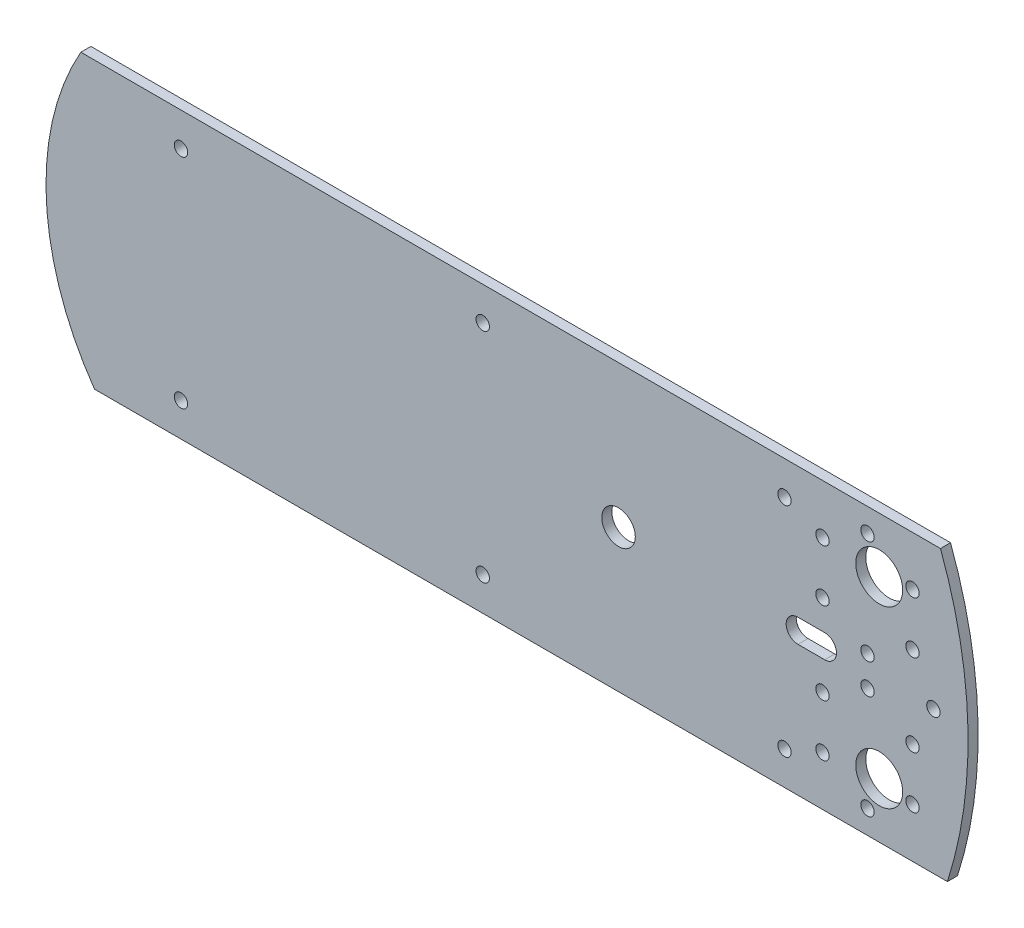
ISO-10303-21;
HEADER;
FILE_DESCRIPTION(('STEP AP214'),'2;1');
FILE_NAME('part.step','',(''),(''),'','','');
FILE_SCHEMA(('AUTOMOTIVE_DESIGN { 1 0 10303 214 1 1 1 1 }'));
ENDSEC;
DATA;
#1=APPLICATION_CONTEXT('core data for automotive mechanical design processes');
#2=APPLICATION_PROTOCOL_DEFINITION('international standard','automotive_design',2000,#1);
#3=PRODUCT_CONTEXT('',#1,'mechanical');
#4=PRODUCT('Part','Part','',(#3));
#5=PRODUCT_RELATED_PRODUCT_CATEGORY('part','',(#4));
#6=PRODUCT_DEFINITION_FORMATION('','',#4);
#7=PRODUCT_DEFINITION_CONTEXT('part definition',#1,'design');
#8=PRODUCT_DEFINITION('design','',#6,#7);
#9=PRODUCT_DEFINITION_SHAPE('','',#8);
#10=(LENGTH_UNIT() NAMED_UNIT(*) SI_UNIT(.MILLI.,.METRE.));
#11=(NAMED_UNIT(*) PLANE_ANGLE_UNIT() SI_UNIT($,.RADIAN.));
#12=(NAMED_UNIT(*) SI_UNIT($,.STERADIAN.) SOLID_ANGLE_UNIT());
#13=UNCERTAINTY_MEASURE_WITH_UNIT(LENGTH_MEASURE(1.E-05),#10,'distance_accuracy_value','');
#14=(GEOMETRIC_REPRESENTATION_CONTEXT(3) GLOBAL_UNCERTAINTY_ASSIGNED_CONTEXT((#13)) GLOBAL_UNIT_ASSIGNED_CONTEXT((#10,
#11,#12)) REPRESENTATION_CONTEXT('',''));
#15=CARTESIAN_POINT('',(0.,0.,0.));
#16=DIRECTION('',(0.,0.,1.));
#17=DIRECTION('',(1.,0.,0.));
#18=AXIS2_PLACEMENT_3D('',#15,#16,#17);
#19=CARTESIAN_POINT('',(122.251926795963,0.,33.));
#20=DIRECTION('',(0.,0.,-1.));
#21=DIRECTION('',(-1.,0.,0.));
#22=AXIS2_PLACEMENT_3D('',#19,#20,#21);
#23=CYLINDRICAL_SURFACE('',#22,3.5);
#24=CARTESIAN_POINT('',(122.251926795963,0.,30.));
#25=DIRECTION('',(0.,0.,1.));
#26=DIRECTION('',(1.,0.,0.));
#27=AXIS2_PLACEMENT_3D('',#24,#25,#26);
#28=CIRCLE('',#27,3.5);
#29=CARTESIAN_POINT('',(122.251926795963,-3.5,30.));
#30=VERTEX_POINT('',#29);
#31=CARTESIAN_POINT('',(122.251926795963,3.5,30.));
#32=VERTEX_POINT('',#31);
#33=EDGE_CURVE('E208',#30,#32,#28,.T.);
#34=ORIENTED_EDGE('',*,*,#33,.F.);
#35=DIRECTION('',(0.,0.,-1.));
#36=VECTOR('',#35,1.);
#37=CARTESIAN_POINT('',(122.251926795963,-3.5,33.));
#38=LINE('',#37,#36);
#39=CARTESIAN_POINT('',(122.251926795963,-3.5,33.));
#40=VERTEX_POINT('',#39);
#41=EDGE_CURVE('E11',#40,#30,#38,.T.);
#42=ORIENTED_EDGE('',*,*,#41,.F.);
#43=CARTESIAN_POINT('',(122.251926795963,0.,33.));
#44=DIRECTION('',(0.,0.,1.));
#45=DIRECTION('',(1.,0.,0.));
#46=AXIS2_PLACEMENT_3D('',#43,#44,#45);
#47=CIRCLE('',#46,3.5);
#48=CARTESIAN_POINT('',(122.251926795963,3.5,33.));
#49=VERTEX_POINT('',#48);
#50=EDGE_CURVE('E125',#40,#49,#47,.T.);
#51=ORIENTED_EDGE('',*,*,#50,.T.);
#52=DIRECTION('',(0.,0.,-1.));
#53=VECTOR('',#52,1.);
#54=CARTESIAN_POINT('',(122.251926795963,3.5,33.));
#55=LINE('',#54,#53);
#56=EDGE_CURVE('E88',#49,#32,#55,.T.);
#57=ORIENTED_EDGE('',*,*,#56,.T.);
#58=EDGE_LOOP('',(#34,#42,#51,#57));
#59=FACE_BOUND('',#58,.T.);
#60=ADVANCED_FACE('F35',(#59),#23,.F.);
#61=CARTESIAN_POINT('',(0.,-3.5,33.));
#62=DIRECTION('',(0.,1.,0.));
#63=DIRECTION('',(0.,0.,1.));
#64=AXIS2_PLACEMENT_3D('',#61,#62,#63);
#65=PLANE('',#64);
#66=DIRECTION('',(1.,0.,0.));
#67=VECTOR('',#66,1.);
#68=CARTESIAN_POINT('',(0.,-3.5,30.));
#69=LINE('',#68,#67);
#70=CARTESIAN_POINT('',(114.251926795963,-3.5,30.));
#71=VERTEX_POINT('',#70);
#72=EDGE_CURVE('E116',#71,#30,#69,.T.);
#73=ORIENTED_EDGE('',*,*,#72,.F.);
#74=DIRECTION('',(0.,0.,-1.));
#75=VECTOR('',#74,1.);
#76=CARTESIAN_POINT('',(114.251926795963,-3.5,33.));
#77=LINE('',#76,#75);
#78=CARTESIAN_POINT('',(114.251926795963,-3.5,33.));
#79=VERTEX_POINT('',#78);
#80=EDGE_CURVE('E45',#79,#71,#77,.T.);
#81=ORIENTED_EDGE('',*,*,#80,.F.);
#82=DIRECTION('',(1.,0.,0.));
#83=VECTOR('',#82,1.);
#84=CARTESIAN_POINT('',(0.,-3.5,33.));
#85=LINE('',#84,#83);
#86=EDGE_CURVE('E114',#79,#40,#85,.T.);
#87=ORIENTED_EDGE('',*,*,#86,.T.);
#88=ORIENTED_EDGE('',*,*,#41,.T.);
#89=EDGE_LOOP('',(#73,#81,#87,#88));
#90=FACE_BOUND('',#89,.T.);
#91=ADVANCED_FACE('F113',(#90),#65,.T.);
#92=CARTESIAN_POINT('',(114.251926795963,0.,33.));
#93=DIRECTION('',(0.,0.,-1.));
#94=DIRECTION('',(-1.,0.,0.));
#95=AXIS2_PLACEMENT_3D('',#92,#93,#94);
#96=CYLINDRICAL_SURFACE('',#95,3.5);
#97=CARTESIAN_POINT('',(114.251926795963,0.,30.));
#98=DIRECTION('',(0.,0.,1.));
#99=DIRECTION('',(1.,0.,0.));
#100=AXIS2_PLACEMENT_3D('',#97,#98,#99);
#101=CIRCLE('',#100,3.5);
#102=CARTESIAN_POINT('',(114.251926795963,3.5,30.));
#103=VERTEX_POINT('',#102);
#104=EDGE_CURVE('E212',#103,#71,#101,.T.);
#105=ORIENTED_EDGE('',*,*,#104,.F.);
#106=DIRECTION('',(0.,0.,-1.));
#107=VECTOR('',#106,1.);
#108=CARTESIAN_POINT('',(114.251926795963,3.5,33.));
#109=LINE('',#108,#107);
#110=CARTESIAN_POINT('',(114.251926795963,3.5,33.));
#111=VERTEX_POINT('',#110);
#112=EDGE_CURVE('E81',#111,#103,#109,.T.);
#113=ORIENTED_EDGE('',*,*,#112,.F.);
#114=CARTESIAN_POINT('',(114.251926795963,0.,33.));
#115=DIRECTION('',(0.,0.,1.));
#116=DIRECTION('',(1.,0.,0.));
#117=AXIS2_PLACEMENT_3D('',#114,#115,#116);
#118=CIRCLE('',#117,3.5);
#119=EDGE_CURVE('E124',#111,#79,#118,.T.);
#120=ORIENTED_EDGE('',*,*,#119,.T.);
#121=ORIENTED_EDGE('',*,*,#80,.T.);
#122=EDGE_LOOP('',(#105,#113,#120,#121));
#123=FACE_BOUND('',#122,.T.);
#124=ADVANCED_FACE('F127',(#123),#96,.F.);
#125=CARTESIAN_POINT('',(0.,-42.5,33.));
#126=DIRECTION('',(0.,1.,0.));
#127=DIRECTION('',(-1.,0.,0.));
#128=AXIS2_PLACEMENT_3D('',#125,#126,#127);
#129=PLANE('',#128);
#130=DIRECTION('',(1.,0.,0.));
#131=VECTOR('',#130,1.);
#132=CARTESIAN_POINT('',(0.,-42.5,30.));
#133=LINE('',#132,#131);
#134=CARTESIAN_POINT('',(-95.5175619591588,-42.5,30.));
#135=VERTEX_POINT('',#134);
#136=CARTESIAN_POINT('',(158.843575197652,-42.5000000000001,30.));
#137=VERTEX_POINT('',#136);
#138=EDGE_CURVE('E187',#135,#137,#133,.T.);
#139=ORIENTED_EDGE('',*,*,#138,.T.);
#140=DIRECTION('',(0.,0.,-1.));
#141=VECTOR('',#140,1.);
#142=CARTESIAN_POINT('',(158.843575197652,-42.5000000000001,33.));
#143=LINE('',#142,#141);
#144=CARTESIAN_POINT('',(158.843575197652,-42.5000000000001,33.));
#145=VERTEX_POINT('',#144);
#146=EDGE_CURVE('E39',#145,#137,#143,.T.);
#147=ORIENTED_EDGE('',*,*,#146,.F.);
#148=DIRECTION('',(1.,0.,0.));
#149=VECTOR('',#148,1.);
#150=CARTESIAN_POINT('',(0.,-42.5,33.));
#151=LINE('',#150,#149);
#152=CARTESIAN_POINT('',(-95.5175619591588,-42.5,33.));
#153=VERTEX_POINT('',#152);
#154=EDGE_CURVE('E270',#153,#145,#151,.T.);
#155=ORIENTED_EDGE('',*,*,#154,.F.);
#156=DIRECTION('',(0.,0.,-1.));
#157=VECTOR('',#156,1.);
#158=CARTESIAN_POINT('',(-95.5175619591588,-42.5,33.));
#159=LINE('',#158,#157);
#160=EDGE_CURVE('E186',#153,#135,#159,.T.);
#161=ORIENTED_EDGE('',*,*,#160,.T.);
#162=EDGE_LOOP('',(#139,#147,#155,#161));
#163=FACE_BOUND('',#162,.T.);
#164=ADVANCED_FACE('F37',(#163),#129,.F.);
#165=CARTESIAN_POINT('',(35.1589151875398,-2.99288439458777,33.));
#166=DIRECTION('',(0.,0.,-1.));
#167=DIRECTION('',(-1.,0.,0.));
#168=AXIS2_PLACEMENT_3D('',#165,#166,#167);
#169=CYLINDRICAL_SURFACE('',#168,129.84108481246);
#170=CARTESIAN_POINT('',(35.1589151875398,-2.99288439458777,30.));
#171=DIRECTION('',(0.,0.,1.));
#172=DIRECTION('',(1.,0.,0.));
#173=AXIS2_PLACEMENT_3D('',#170,#171,#172);
#174=CIRCLE('',#173,129.84108481246);
#175=CARTESIAN_POINT('',(156.769378449289,42.5,30.));
#176=VERTEX_POINT('',#175);
#177=EDGE_CURVE('E190',#137,#176,#174,.T.);
#178=ORIENTED_EDGE('',*,*,#177,.T.);
#179=DIRECTION('',(0.,0.,-1.));
#180=VECTOR('',#179,1.);
#181=CARTESIAN_POINT('',(156.769378449289,42.5,33.));
#182=LINE('',#181,#180);
#183=CARTESIAN_POINT('',(156.769378449289,42.5,33.));
#184=VERTEX_POINT('',#183);
#185=EDGE_CURVE('E277',#184,#176,#182,.T.);
#186=ORIENTED_EDGE('',*,*,#185,.F.);
#187=CARTESIAN_POINT('',(35.1589151875398,-2.99288439458777,33.));
#188=DIRECTION('',(0.,0.,1.));
#189=DIRECTION('',(1.,0.,0.));
#190=AXIS2_PLACEMENT_3D('',#187,#188,#189);
#191=CIRCLE('',#190,129.84108481246);
#192=EDGE_CURVE('E96',#145,#184,#191,.T.);
#193=ORIENTED_EDGE('',*,*,#192,.F.);
#194=ORIENTED_EDGE('',*,*,#146,.T.);
#195=EDGE_LOOP('',(#178,#186,#193,#194));
#196=FACE_BOUND('',#195,.T.);
#197=ADVANCED_FACE('F283',(#196),#169,.T.);
#198=CARTESIAN_POINT('',(0.,42.5,33.));
#199=DIRECTION('',(0.,-1.,0.));
#200=DIRECTION('',(0.,0.,-1.));
#201=AXIS2_PLACEMENT_3D('',#198,#199,#200);
#202=PLANE('',#201);
#203=DIRECTION('',(-1.,0.,0.));
#204=VECTOR('',#203,1.);
#205=CARTESIAN_POINT('',(0.,42.5,30.));
#206=LINE('',#205,#204);
#207=CARTESIAN_POINT('',(-99.6042316581529,42.5,30.));
#208=VERTEX_POINT('',#207);
#209=EDGE_CURVE('E192',#176,#208,#206,.T.);
#210=ORIENTED_EDGE('',*,*,#209,.T.);
#211=DIRECTION('',(0.,0.,-1.));
#212=VECTOR('',#211,1.);
#213=CARTESIAN_POINT('',(-99.6042316581529,42.5,33.));
#214=LINE('',#213,#212);
#215=CARTESIAN_POINT('',(-99.6042316581529,42.5,33.));
#216=VERTEX_POINT('',#215);
#217=EDGE_CURVE('E275',#216,#208,#214,.T.);
#218=ORIENTED_EDGE('',*,*,#217,.F.);
#219=DIRECTION('',(-1.,0.,0.));
#220=VECTOR('',#219,1.);
#221=CARTESIAN_POINT('',(0.,42.5,33.));
#222=LINE('',#221,#220);
#223=EDGE_CURVE('E300',#184,#216,#222,.T.);
#224=ORIENTED_EDGE('',*,*,#223,.F.);
#225=ORIENTED_EDGE('',*,*,#185,.T.);
#226=EDGE_LOOP('',(#210,#218,#224,#225));
#227=FACE_BOUND('',#226,.T.);
#228=ADVANCED_FACE('F293',(#227),#202,.F.);
#229=CARTESIAN_POINT('',(148.423393758659,27.7499999999999,33.));
#230=DIRECTION('',(0.,0.,-1.));
#231=DIRECTION('',(-1.,0.,0.));
#232=AXIS2_PLACEMENT_3D('',#229,#230,#231);
#233=CYLINDRICAL_SURFACE('',#232,2.);
#234=CARTESIAN_POINT('',(148.423393758659,27.7499999999999,33.));
#235=DIRECTION('',(0.,0.,1.));
#236=DIRECTION('',(1.,0.,0.));
#237=AXIS2_PLACEMENT_3D('',#234,#235,#236);
#238=CIRCLE('',#237,2.);
#239=CARTESIAN_POINT('',(150.423393758659,27.7499999999999,33.));
#240=VERTEX_POINT('',#239);
#241=EDGE_CURVE('E180',#240,#240,#238,.T.);
#242=ORIENTED_EDGE('',*,*,#241,.T.);
#243=EDGE_LOOP('',(#242));
#244=FACE_BOUND('',#243,.T.);
#245=CARTESIAN_POINT('',(148.423393758659,27.7499999999999,30.));
#246=DIRECTION('',(0.,0.,1.));
#247=DIRECTION('',(1.,0.,0.));
#248=AXIS2_PLACEMENT_3D('',#245,#246,#247);
#249=CIRCLE('',#248,2.);
#250=CARTESIAN_POINT('',(150.423393758659,27.7499999999999,30.));
#251=VERTEX_POINT('',#250);
#252=EDGE_CURVE('E264',#251,#251,#249,.T.);
#253=ORIENTED_EDGE('',*,*,#252,.F.);
#254=EDGE_LOOP('',(#253));
#255=FACE_BOUND('',#254,.T.);
#256=ADVANCED_FACE('F355',(#244,#255),#233,.F.);
#257=CARTESIAN_POINT('',(148.423393758659,12.2499999999999,33.));
#258=DIRECTION('',(0.,0.,-1.));
#259=DIRECTION('',(-1.,0.,0.));
#260=AXIS2_PLACEMENT_3D('',#257,#258,#259);
#261=CYLINDRICAL_SURFACE('',#260,2.);
#262=CARTESIAN_POINT('',(148.423393758659,12.2499999999999,33.));
#263=DIRECTION('',(0.,0.,1.));
#264=DIRECTION('',(1.,0.,0.));
#265=AXIS2_PLACEMENT_3D('',#262,#263,#264);
#266=CIRCLE('',#265,2.);
#267=CARTESIAN_POINT('',(150.423393758659,12.2499999999999,33.));
#268=VERTEX_POINT('',#267);
#269=EDGE_CURVE('E177',#268,#268,#266,.T.);
#270=ORIENTED_EDGE('',*,*,#269,.T.);
#271=EDGE_LOOP('',(#270));
#272=FACE_BOUND('',#271,.T.);
#273=CARTESIAN_POINT('',(148.423393758659,12.2499999999999,30.));
#274=DIRECTION('',(0.,0.,1.));
#275=DIRECTION('',(1.,0.,0.));
#276=AXIS2_PLACEMENT_3D('',#273,#274,#275);
#277=CIRCLE('',#276,2.);
#278=CARTESIAN_POINT('',(150.423393758659,12.2499999999999,30.));
#279=VERTEX_POINT('',#278);
#280=EDGE_CURVE('E261',#279,#279,#277,.T.);
#281=ORIENTED_EDGE('',*,*,#280,.F.);
#282=EDGE_LOOP('',(#281));
#283=FACE_BOUND('',#282,.T.);
#284=ADVANCED_FACE('F524',(#272,#283),#261,.F.);
#285=CARTESIAN_POINT('',(121.576606241341,12.2500000000001,33.));
#286=DIRECTION('',(0.,0.,-1.));
#287=DIRECTION('',(-1.,0.,0.));
#288=AXIS2_PLACEMENT_3D('',#285,#286,#287);
#289=CYLINDRICAL_SURFACE('',#288,2.);
#290=CARTESIAN_POINT('',(121.576606241341,12.2500000000001,33.));
#291=DIRECTION('',(0.,0.,1.));
#292=DIRECTION('',(1.,0.,0.));
#293=AXIS2_PLACEMENT_3D('',#290,#291,#292);
#294=CIRCLE('',#293,2.);
#295=CARTESIAN_POINT('',(123.576606241341,12.2500000000001,33.));
#296=VERTEX_POINT('',#295);
#297=EDGE_CURVE('E174',#296,#296,#294,.T.);
#298=ORIENTED_EDGE('',*,*,#297,.T.);
#299=EDGE_LOOP('',(#298));
#300=FACE_BOUND('',#299,.T.);
#301=CARTESIAN_POINT('',(121.576606241341,12.2500000000001,30.));
#302=DIRECTION('',(0.,0.,1.));
#303=DIRECTION('',(1.,0.,0.));
#304=AXIS2_PLACEMENT_3D('',#301,#302,#303);
#305=CIRCLE('',#304,2.);
#306=CARTESIAN_POINT('',(123.576606241341,12.2500000000001,30.));
#307=VERTEX_POINT('',#306);
#308=EDGE_CURVE('E258',#307,#307,#305,.T.);
#309=ORIENTED_EDGE('',*,*,#308,.F.);
#310=EDGE_LOOP('',(#309));
#311=FACE_BOUND('',#310,.T.);
#312=ADVANCED_FACE('F528',(#300,#311),#289,.F.);
#313=CARTESIAN_POINT('',(135.,4.5,33.));
#314=DIRECTION('',(0.,0.,-1.));
#315=DIRECTION('',(-1.,0.,0.));
#316=AXIS2_PLACEMENT_3D('',#313,#314,#315);
#317=CYLINDRICAL_SURFACE('',#316,2.);
#318=CARTESIAN_POINT('',(135.,4.5,33.));
#319=DIRECTION('',(0.,0.,1.));
#320=DIRECTION('',(1.,0.,0.));
#321=AXIS2_PLACEMENT_3D('',#318,#319,#320);
#322=CIRCLE('',#321,2.);
#323=CARTESIAN_POINT('',(137.,4.5,33.));
#324=VERTEX_POINT('',#323);
#325=EDGE_CURVE('E171',#324,#324,#322,.T.);
#326=ORIENTED_EDGE('',*,*,#325,.T.);
#327=EDGE_LOOP('',(#326));
#328=FACE_BOUND('',#327,.T.);
#329=CARTESIAN_POINT('',(135.,4.5,30.));
#330=DIRECTION('',(0.,0.,1.));
#331=DIRECTION('',(1.,0.,0.));
#332=AXIS2_PLACEMENT_3D('',#329,#330,#331);
#333=CIRCLE('',#332,2.);
#334=CARTESIAN_POINT('',(137.,4.5,30.));
#335=VERTEX_POINT('',#334);
#336=EDGE_CURVE('E255',#335,#335,#333,.T.);
#337=ORIENTED_EDGE('',*,*,#336,.F.);
#338=EDGE_LOOP('',(#337));
#339=FACE_BOUND('',#338,.T.);
#340=ADVANCED_FACE('F532',(#328,#339),#317,.F.);
#341=CARTESIAN_POINT('',(121.576606241341,27.7500000000001,33.));
#342=DIRECTION('',(0.,0.,-1.));
#343=DIRECTION('',(-1.,0.,0.));
#344=AXIS2_PLACEMENT_3D('',#341,#342,#343);
#345=CYLINDRICAL_SURFACE('',#344,2.);
#346=CARTESIAN_POINT('',(121.576606241341,27.7500000000001,33.));
#347=DIRECTION('',(0.,0.,1.));
#348=DIRECTION('',(1.,0.,0.));
#349=AXIS2_PLACEMENT_3D('',#346,#347,#348);
#350=CIRCLE('',#349,2.);
#351=CARTESIAN_POINT('',(123.576606241341,27.7500000000001,33.));
#352=VERTEX_POINT('',#351);
#353=EDGE_CURVE('E168',#352,#352,#350,.T.);
#354=ORIENTED_EDGE('',*,*,#353,.T.);
#355=EDGE_LOOP('',(#354));
#356=FACE_BOUND('',#355,.T.);
#357=CARTESIAN_POINT('',(121.576606241341,27.7500000000001,30.));
#358=DIRECTION('',(0.,0.,1.));
#359=DIRECTION('',(1.,0.,0.));
#360=AXIS2_PLACEMENT_3D('',#357,#358,#359);
#361=CIRCLE('',#360,2.);
#362=CARTESIAN_POINT('',(123.576606241341,27.7500000000001,30.));
#363=VERTEX_POINT('',#362);
#364=EDGE_CURVE('E252',#363,#363,#361,.T.);
#365=ORIENTED_EDGE('',*,*,#364,.F.);
#366=EDGE_LOOP('',(#365));
#367=FACE_BOUND('',#366,.T.);
#368=ADVANCED_FACE('F536',(#356,#367),#345,.F.);
#369=CARTESIAN_POINT('',(135.,35.5,33.));
#370=DIRECTION('',(0.,0.,-1.));
#371=DIRECTION('',(-1.,0.,0.));
#372=AXIS2_PLACEMENT_3D('',#369,#370,#371);
#373=CYLINDRICAL_SURFACE('',#372,2.);
#374=CARTESIAN_POINT('',(135.,35.5,33.));
#375=DIRECTION('',(0.,0.,1.));
#376=DIRECTION('',(1.,0.,0.));
#377=AXIS2_PLACEMENT_3D('',#374,#375,#376);
#378=CIRCLE('',#377,2.);
#379=CARTESIAN_POINT('',(137.,35.5,33.));
#380=VERTEX_POINT('',#379);
#381=EDGE_CURVE('E165',#380,#380,#378,.T.);
#382=ORIENTED_EDGE('',*,*,#381,.T.);
#383=EDGE_LOOP('',(#382));
#384=FACE_BOUND('',#383,.T.);
#385=CARTESIAN_POINT('',(135.,35.5,30.));
#386=DIRECTION('',(0.,0.,1.));
#387=DIRECTION('',(1.,0.,0.));
#388=AXIS2_PLACEMENT_3D('',#385,#386,#387);
#389=CIRCLE('',#388,2.);
#390=CARTESIAN_POINT('',(137.,35.5,30.));
#391=VERTEX_POINT('',#390);
#392=EDGE_CURVE('E249',#391,#391,#389,.T.);
#393=ORIENTED_EDGE('',*,*,#392,.F.);
#394=EDGE_LOOP('',(#393));
#395=FACE_BOUND('',#394,.T.);
#396=ADVANCED_FACE('F540',(#384,#395),#373,.F.);
#397=CARTESIAN_POINT('',(138.5,26.062177826491,33.));
#398=DIRECTION('',(0.,0.,-1.));
#399=DIRECTION('',(-1.,0.,0.));
#400=AXIS2_PLACEMENT_3D('',#397,#398,#399);
#401=CYLINDRICAL_SURFACE('',#400,7.00000000000001);
#402=CARTESIAN_POINT('',(138.5,26.062177826491,33.));
#403=DIRECTION('',(0.,0.,1.));
#404=DIRECTION('',(1.,0.,0.));
#405=AXIS2_PLACEMENT_3D('',#402,#403,#404);
#406=CIRCLE('',#405,7.00000000000001);
#407=CARTESIAN_POINT('',(145.5,26.062177826491,33.));
#408=VERTEX_POINT('',#407);
#409=EDGE_CURVE('E162',#408,#408,#406,.T.);
#410=ORIENTED_EDGE('',*,*,#409,.T.);
#411=EDGE_LOOP('',(#410));
#412=FACE_BOUND('',#411,.T.);
#413=CARTESIAN_POINT('',(138.5,26.062177826491,30.));
#414=DIRECTION('',(0.,0.,1.));
#415=DIRECTION('',(1.,0.,0.));
#416=AXIS2_PLACEMENT_3D('',#413,#414,#415);
#417=CIRCLE('',#416,7.00000000000001);
#418=CARTESIAN_POINT('',(145.5,26.062177826491,30.));
#419=VERTEX_POINT('',#418);
#420=EDGE_CURVE('E246',#419,#419,#417,.T.);
#421=ORIENTED_EDGE('',*,*,#420,.F.);
#422=EDGE_LOOP('',(#421));
#423=FACE_BOUND('',#422,.T.);
#424=ADVANCED_FACE('F544',(#412,#423),#401,.F.);
#425=CARTESIAN_POINT('',(138.5,-26.0621778264911,33.));
#426=DIRECTION('',(0.,0.,-1.));
#427=DIRECTION('',(-1.,0.,0.));
#428=AXIS2_PLACEMENT_3D('',#425,#426,#427);
#429=CYLINDRICAL_SURFACE('',#428,7.00000000000001);
#430=CARTESIAN_POINT('',(138.5,-26.0621778264911,33.));
#431=DIRECTION('',(0.,0.,1.));
#432=DIRECTION('',(1.,0.,0.));
#433=AXIS2_PLACEMENT_3D('',#430,#431,#432);
#434=CIRCLE('',#433,7.00000000000001);
#435=CARTESIAN_POINT('',(145.5,-26.0621778264911,33.));
#436=VERTEX_POINT('',#435);
#437=EDGE_CURVE('E159',#436,#436,#434,.T.);
#438=ORIENTED_EDGE('',*,*,#437,.T.);
#439=EDGE_LOOP('',(#438));
#440=FACE_BOUND('',#439,.T.);
#441=CARTESIAN_POINT('',(138.5,-26.0621778264911,30.));
#442=DIRECTION('',(0.,0.,1.));
#443=DIRECTION('',(1.,0.,0.));
#444=AXIS2_PLACEMENT_3D('',#441,#442,#443);
#445=CIRCLE('',#444,7.00000000000001);
#446=CARTESIAN_POINT('',(145.5,-26.0621778264911,30.));
#447=VERTEX_POINT('',#446);
#448=EDGE_CURVE('E243',#447,#447,#445,.T.);
#449=ORIENTED_EDGE('',*,*,#448,.F.);
#450=EDGE_LOOP('',(#449));
#451=FACE_BOUND('',#450,.T.);
#452=ADVANCED_FACE('F548',(#440,#451),#429,.F.);
#453=CARTESIAN_POINT('',(121.576606241341,-27.7500000000001,33.));
#454=DIRECTION('',(0.,0.,-1.));
#455=DIRECTION('',(-1.,0.,0.));
#456=AXIS2_PLACEMENT_3D('',#453,#454,#455);
#457=CYLINDRICAL_SURFACE('',#456,2.);
#458=CARTESIAN_POINT('',(121.576606241341,-27.7500000000001,33.));
#459=DIRECTION('',(0.,0.,1.));
#460=DIRECTION('',(1.,0.,0.));
#461=AXIS2_PLACEMENT_3D('',#458,#459,#460);
#462=CIRCLE('',#461,2.);
#463=CARTESIAN_POINT('',(123.576606241341,-27.7500000000001,33.));
#464=VERTEX_POINT('',#463);
#465=EDGE_CURVE('E156',#464,#464,#462,.T.);
#466=ORIENTED_EDGE('',*,*,#465,.T.);
#467=EDGE_LOOP('',(#466));
#468=FACE_BOUND('',#467,.T.);
#469=CARTESIAN_POINT('',(121.576606241341,-27.7500000000001,30.));
#470=DIRECTION('',(0.,0.,1.));
#471=DIRECTION('',(1.,0.,0.));
#472=AXIS2_PLACEMENT_3D('',#469,#470,#471);
#473=CIRCLE('',#472,2.);
#474=CARTESIAN_POINT('',(123.576606241341,-27.7500000000001,30.));
#475=VERTEX_POINT('',#474);
#476=EDGE_CURVE('E240',#475,#475,#473,.T.);
#477=ORIENTED_EDGE('',*,*,#476,.F.);
#478=EDGE_LOOP('',(#477));
#479=FACE_BOUND('',#478,.T.);
#480=ADVANCED_FACE('F552',(#468,#479),#457,.F.);
#481=CARTESIAN_POINT('',(121.576606241341,-12.2500000000001,33.));
#482=DIRECTION('',(0.,0.,-1.));
#483=DIRECTION('',(-1.,0.,0.));
#484=AXIS2_PLACEMENT_3D('',#481,#482,#483);
#485=CYLINDRICAL_SURFACE('',#484,2.);
#486=CARTESIAN_POINT('',(121.576606241341,-12.2500000000001,33.));
#487=DIRECTION('',(0.,0.,1.));
#488=DIRECTION('',(1.,0.,0.));
#489=AXIS2_PLACEMENT_3D('',#486,#487,#488);
#490=CIRCLE('',#489,2.);
#491=CARTESIAN_POINT('',(123.576606241341,-12.2500000000001,33.));
#492=VERTEX_POINT('',#491);
#493=EDGE_CURVE('E153',#492,#492,#490,.T.);
#494=ORIENTED_EDGE('',*,*,#493,.T.);
#495=EDGE_LOOP('',(#494));
#496=FACE_BOUND('',#495,.T.);
#497=CARTESIAN_POINT('',(121.576606241341,-12.2500000000001,30.));
#498=DIRECTION('',(0.,0.,1.));
#499=DIRECTION('',(1.,0.,0.));
#500=AXIS2_PLACEMENT_3D('',#497,#498,#499);
#501=CIRCLE('',#500,2.);
#502=CARTESIAN_POINT('',(123.576606241341,-12.2500000000001,30.));
#503=VERTEX_POINT('',#502);
#504=EDGE_CURVE('E237',#503,#503,#501,.T.);
#505=ORIENTED_EDGE('',*,*,#504,.F.);
#506=EDGE_LOOP('',(#505));
#507=FACE_BOUND('',#506,.T.);
#508=ADVANCED_FACE('F556',(#496,#507),#485,.F.);
#509=CARTESIAN_POINT('',(135.,-4.5,33.));
#510=DIRECTION('',(0.,0.,-1.));
#511=DIRECTION('',(-1.,0.,0.));
#512=AXIS2_PLACEMENT_3D('',#509,#510,#511);
#513=CYLINDRICAL_SURFACE('',#512,2.);
#514=CARTESIAN_POINT('',(135.,-4.5,33.));
#515=DIRECTION('',(0.,0.,1.));
#516=DIRECTION('',(1.,0.,0.));
#517=AXIS2_PLACEMENT_3D('',#514,#515,#516);
#518=CIRCLE('',#517,2.);
#519=CARTESIAN_POINT('',(137.,-4.5,33.));
#520=VERTEX_POINT('',#519);
#521=EDGE_CURVE('E150',#520,#520,#518,.T.);
#522=ORIENTED_EDGE('',*,*,#521,.T.);
#523=EDGE_LOOP('',(#522));
#524=FACE_BOUND('',#523,.T.);
#525=CARTESIAN_POINT('',(135.,-4.5,30.));
#526=DIRECTION('',(0.,0.,1.));
#527=DIRECTION('',(1.,0.,0.));
#528=AXIS2_PLACEMENT_3D('',#525,#526,#527);
#529=CIRCLE('',#528,2.);
#530=CARTESIAN_POINT('',(137.,-4.5,30.));
#531=VERTEX_POINT('',#530);
#532=EDGE_CURVE('E234',#531,#531,#529,.T.);
#533=ORIENTED_EDGE('',*,*,#532,.F.);
#534=EDGE_LOOP('',(#533));
#535=FACE_BOUND('',#534,.T.);
#536=ADVANCED_FACE('F560',(#524,#535),#513,.F.);
#537=CARTESIAN_POINT('',(148.423393758659,-12.2499999999999,33.));
#538=DIRECTION('',(0.,0.,-1.));
#539=DIRECTION('',(-1.,0.,0.));
#540=AXIS2_PLACEMENT_3D('',#537,#538,#539);
#541=CYLINDRICAL_SURFACE('',#540,2.);
#542=CARTESIAN_POINT('',(148.423393758659,-12.2499999999999,33.));
#543=DIRECTION('',(0.,0.,1.));
#544=DIRECTION('',(1.,0.,0.));
#545=AXIS2_PLACEMENT_3D('',#542,#543,#544);
#546=CIRCLE('',#545,2.);
#547=CARTESIAN_POINT('',(150.423393758659,-12.2499999999999,33.));
#548=VERTEX_POINT('',#547);
#549=EDGE_CURVE('E147',#548,#548,#546,.T.);
#550=ORIENTED_EDGE('',*,*,#549,.T.);
#551=EDGE_LOOP('',(#550));
#552=FACE_BOUND('',#551,.T.);
#553=CARTESIAN_POINT('',(148.423393758659,-12.2499999999999,30.));
#554=DIRECTION('',(0.,0.,1.));
#555=DIRECTION('',(1.,0.,0.));
#556=AXIS2_PLACEMENT_3D('',#553,#554,#555);
#557=CIRCLE('',#556,2.);
#558=CARTESIAN_POINT('',(150.423393758659,-12.2499999999999,30.));
#559=VERTEX_POINT('',#558);
#560=EDGE_CURVE('E231',#559,#559,#557,.T.);
#561=ORIENTED_EDGE('',*,*,#560,.F.);
#562=EDGE_LOOP('',(#561));
#563=FACE_BOUND('',#562,.T.);
#564=ADVANCED_FACE('F564',(#552,#563),#541,.F.);
#565=CARTESIAN_POINT('',(148.423393758659,-27.7499999999999,33.));
#566=DIRECTION('',(0.,0.,-1.));
#567=DIRECTION('',(-1.,0.,0.));
#568=AXIS2_PLACEMENT_3D('',#565,#566,#567);
#569=CYLINDRICAL_SURFACE('',#568,2.);
#570=CARTESIAN_POINT('',(148.423393758659,-27.7499999999999,33.));
#571=DIRECTION('',(0.,0.,1.));
#572=DIRECTION('',(1.,0.,0.));
#573=AXIS2_PLACEMENT_3D('',#570,#571,#572);
#574=CIRCLE('',#573,2.);
#575=CARTESIAN_POINT('',(150.423393758659,-27.7499999999999,33.));
#576=VERTEX_POINT('',#575);
#577=EDGE_CURVE('E144',#576,#576,#574,.T.);
#578=ORIENTED_EDGE('',*,*,#577,.T.);
#579=EDGE_LOOP('',(#578));
#580=FACE_BOUND('',#579,.T.);
#581=CARTESIAN_POINT('',(148.423393758659,-27.7499999999999,30.));
#582=DIRECTION('',(0.,0.,1.));
#583=DIRECTION('',(1.,0.,0.));
#584=AXIS2_PLACEMENT_3D('',#581,#582,#583);
#585=CIRCLE('',#584,2.);
#586=CARTESIAN_POINT('',(150.423393758659,-27.7499999999999,30.));
#587=VERTEX_POINT('',#586);
#588=EDGE_CURVE('E228',#587,#587,#585,.T.);
#589=ORIENTED_EDGE('',*,*,#588,.F.);
#590=EDGE_LOOP('',(#589));
#591=FACE_BOUND('',#590,.T.);
#592=ADVANCED_FACE('F568',(#580,#591),#569,.F.);
#593=CARTESIAN_POINT('',(135.,-35.5,33.));
#594=DIRECTION('',(0.,0.,-1.));
#595=DIRECTION('',(-1.,0.,0.));
#596=AXIS2_PLACEMENT_3D('',#593,#594,#595);
#597=CYLINDRICAL_SURFACE('',#596,2.);
#598=CARTESIAN_POINT('',(135.,-35.5,33.));
#599=DIRECTION('',(0.,0.,1.));
#600=DIRECTION('',(1.,0.,0.));
#601=AXIS2_PLACEMENT_3D('',#598,#599,#600);
#602=CIRCLE('',#601,2.);
#603=CARTESIAN_POINT('',(137.,-35.5,33.));
#604=VERTEX_POINT('',#603);
#605=EDGE_CURVE('E141',#604,#604,#602,.T.);
#606=ORIENTED_EDGE('',*,*,#605,.T.);
#607=EDGE_LOOP('',(#606));
#608=FACE_BOUND('',#607,.T.);
#609=CARTESIAN_POINT('',(135.,-35.5,30.));
#610=DIRECTION('',(0.,0.,1.));
#611=DIRECTION('',(1.,0.,0.));
#612=AXIS2_PLACEMENT_3D('',#609,#610,#611);
#613=CIRCLE('',#612,2.);
#614=CARTESIAN_POINT('',(137.,-35.5,30.));
#615=VERTEX_POINT('',#614);
#616=EDGE_CURVE('E225',#615,#615,#613,.T.);
#617=ORIENTED_EDGE('',*,*,#616,.F.);
#618=EDGE_LOOP('',(#617));
#619=FACE_BOUND('',#618,.T.);
#620=ADVANCED_FACE('F572',(#608,#619),#597,.F.);
#621=CARTESIAN_POINT('',(110.251926795963,32.5,33.));
#622=DIRECTION('',(0.,0.,-1.));
#623=DIRECTION('',(-1.,0.,0.));
#624=AXIS2_PLACEMENT_3D('',#621,#622,#623);
#625=CYLINDRICAL_SURFACE('',#624,2.);
#626=CARTESIAN_POINT('',(110.251926795963,32.5,33.));
#627=DIRECTION('',(0.,0.,1.));
#628=DIRECTION('',(1.,0.,0.));
#629=AXIS2_PLACEMENT_3D('',#626,#627,#628);
#630=CIRCLE('',#629,2.);
#631=CARTESIAN_POINT('',(112.251926795963,32.5,33.));
#632=VERTEX_POINT('',#631);
#633=EDGE_CURVE('E138',#632,#632,#630,.T.);
#634=ORIENTED_EDGE('',*,*,#633,.T.);
#635=EDGE_LOOP('',(#634));
#636=FACE_BOUND('',#635,.T.);
#637=CARTESIAN_POINT('',(110.251926795963,32.5,30.));
#638=DIRECTION('',(0.,0.,1.));
#639=DIRECTION('',(1.,0.,0.));
#640=AXIS2_PLACEMENT_3D('',#637,#638,#639);
#641=CIRCLE('',#640,2.);
#642=CARTESIAN_POINT('',(112.251926795963,32.5,30.));
#643=VERTEX_POINT('',#642);
#644=EDGE_CURVE('E222',#643,#643,#641,.T.);
#645=ORIENTED_EDGE('',*,*,#644,.F.);
#646=EDGE_LOOP('',(#645));
#647=FACE_BOUND('',#646,.T.);
#648=ADVANCED_FACE('F576',(#636,#647),#625,.F.);
#649=CARTESIAN_POINT('',(154.662682889879,0.,33.));
#650=DIRECTION('',(0.,0.,-1.));
#651=DIRECTION('',(-1.,0.,0.));
#652=AXIS2_PLACEMENT_3D('',#649,#650,#651);
#653=CYLINDRICAL_SURFACE('',#652,2.);
#654=CARTESIAN_POINT('',(154.662682889879,0.,33.));
#655=DIRECTION('',(0.,0.,1.));
#656=DIRECTION('',(1.,0.,0.));
#657=AXIS2_PLACEMENT_3D('',#654,#655,#656);
#658=CIRCLE('',#657,2.);
#659=CARTESIAN_POINT('',(156.662682889879,0.,33.));
#660=VERTEX_POINT('',#659);
#661=EDGE_CURVE('E135',#660,#660,#658,.T.);
#662=ORIENTED_EDGE('',*,*,#661,.T.);
#663=EDGE_LOOP('',(#662));
#664=FACE_BOUND('',#663,.T.);
#665=CARTESIAN_POINT('',(154.662682889879,0.,30.));
#666=DIRECTION('',(0.,0.,1.));
#667=DIRECTION('',(1.,0.,0.));
#668=AXIS2_PLACEMENT_3D('',#665,#666,#667);
#669=CIRCLE('',#668,2.);
#670=CARTESIAN_POINT('',(156.662682889879,0.,30.));
#671=VERTEX_POINT('',#670);
#672=EDGE_CURVE('E219',#671,#671,#669,.T.);
#673=ORIENTED_EDGE('',*,*,#672,.F.);
#674=EDGE_LOOP('',(#673));
#675=FACE_BOUND('',#674,.T.);
#676=ADVANCED_FACE('F329',(#664,#675),#653,.F.);
#677=CARTESIAN_POINT('',(110.251926795963,-32.5,33.));
#678=DIRECTION('',(0.,0.,-1.));
#679=DIRECTION('',(-1.,0.,0.));
#680=AXIS2_PLACEMENT_3D('',#677,#678,#679);
#681=CYLINDRICAL_SURFACE('',#680,2.);
#682=CARTESIAN_POINT('',(110.251926795963,-32.5,33.));
#683=DIRECTION('',(0.,0.,1.));
#684=DIRECTION('',(1.,0.,0.));
#685=AXIS2_PLACEMENT_3D('',#682,#683,#684);
#686=CIRCLE('',#685,2.);
#687=CARTESIAN_POINT('',(112.251926795963,-32.5,33.));
#688=VERTEX_POINT('',#687);
#689=EDGE_CURVE('E129',#688,#688,#686,.T.);
#690=ORIENTED_EDGE('',*,*,#689,.T.);
#691=EDGE_LOOP('',(#690));
#692=FACE_BOUND('',#691,.T.);
#693=CARTESIAN_POINT('',(110.251926795963,-32.5,30.));
#694=DIRECTION('',(0.,0.,1.));
#695=DIRECTION('',(1.,0.,0.));
#696=AXIS2_PLACEMENT_3D('',#693,#694,#695);
#697=CIRCLE('',#696,2.);
#698=CARTESIAN_POINT('',(112.251926795963,-32.5,30.));
#699=VERTEX_POINT('',#698);
#700=EDGE_CURVE('E216',#699,#699,#697,.T.);
#701=ORIENTED_EDGE('',*,*,#700,.F.);
#702=EDGE_LOOP('',(#701));
#703=FACE_BOUND('',#702,.T.);
#704=ADVANCED_FACE('F320',(#692,#703),#681,.F.);
#705=CARTESIAN_POINT('',(0.,3.5,33.));
#706=DIRECTION('',(0.,1.,0.));
#707=DIRECTION('',(0.,0.,1.));
#708=AXIS2_PLACEMENT_3D('',#705,#706,#707);
#709=PLANE('',#708);
#710=DIRECTION('',(1.,0.,0.));
#711=VECTOR('',#710,1.);
#712=CARTESIAN_POINT('',(0.,3.5,30.));
#713=LINE('',#712,#711);
#714=EDGE_CURVE('E214',#103,#32,#713,.T.);
#715=ORIENTED_EDGE('',*,*,#714,.T.);
#716=ORIENTED_EDGE('',*,*,#56,.F.);
#717=DIRECTION('',(1.,0.,0.));
#718=VECTOR('',#717,1.);
#719=CARTESIAN_POINT('',(0.,3.5,33.));
#720=LINE('',#719,#718);
#721=EDGE_CURVE('E54',#111,#49,#720,.T.);
#722=ORIENTED_EDGE('',*,*,#721,.F.);
#723=ORIENTED_EDGE('',*,*,#112,.T.);
#724=EDGE_LOOP('',(#715,#716,#722,#723));
#725=FACE_BOUND('',#724,.T.);
#726=ADVANCED_FACE('F317',(#725),#709,.F.);
#727=CARTESIAN_POINT('',(-69.7480732040373,32.5,33.));
#728=DIRECTION('',(0.,0.,-1.));
#729=DIRECTION('',(-1.,0.,0.));
#730=AXIS2_PLACEMENT_3D('',#727,#728,#729);
#731=CYLINDRICAL_SURFACE('',#730,2.);
#732=CARTESIAN_POINT('',(-69.7480732040373,32.5,33.));
#733=DIRECTION('',(0.,0.,1.));
#734=DIRECTION('',(1.,0.,0.));
#735=AXIS2_PLACEMENT_3D('',#732,#733,#734);
#736=CIRCLE('',#735,2.);
#737=CARTESIAN_POINT('',(-67.7480732040373,32.5,33.));
#738=VERTEX_POINT('',#737);
#739=EDGE_CURVE('E313',#738,#738,#736,.T.);
#740=ORIENTED_EDGE('',*,*,#739,.T.);
#741=EDGE_LOOP('',(#740));
#742=FACE_BOUND('',#741,.T.);
#743=CARTESIAN_POINT('',(-69.7480732040373,32.5,30.));
#744=DIRECTION('',(0.,0.,1.));
#745=DIRECTION('',(1.,0.,0.));
#746=AXIS2_PLACEMENT_3D('',#743,#744,#745);
#747=CIRCLE('',#746,2.);
#748=CARTESIAN_POINT('',(-67.7480732040373,32.5,30.));
#749=VERTEX_POINT('',#748);
#750=EDGE_CURVE('E205',#749,#749,#747,.T.);
#751=ORIENTED_EDGE('',*,*,#750,.F.);
#752=EDGE_LOOP('',(#751));
#753=FACE_BOUND('',#752,.T.);
#754=ADVANCED_FACE('F319',(#742,#753),#731,.F.);
#755=CARTESIAN_POINT('',(20.2519267959627,32.5,33.));
#756=DIRECTION('',(0.,0.,-1.));
#757=DIRECTION('',(-1.,0.,0.));
#758=AXIS2_PLACEMENT_3D('',#755,#756,#757);
#759=CYLINDRICAL_SURFACE('',#758,2.00000000000001);
#760=CARTESIAN_POINT('',(20.2519267959627,32.5,33.));
#761=DIRECTION('',(0.,0.,1.));
#762=DIRECTION('',(1.,0.,0.));
#763=AXIS2_PLACEMENT_3D('',#760,#761,#762);
#764=CIRCLE('',#763,2.00000000000001);
#765=CARTESIAN_POINT('',(22.2519267959627,32.5,33.));
#766=VERTEX_POINT('',#765);
#767=EDGE_CURVE('E310',#766,#766,#764,.T.);
#768=ORIENTED_EDGE('',*,*,#767,.T.);
#769=EDGE_LOOP('',(#768));
#770=FACE_BOUND('',#769,.T.);
#771=CARTESIAN_POINT('',(20.2519267959627,32.5,30.));
#772=DIRECTION('',(0.,0.,1.));
#773=DIRECTION('',(1.,0.,0.));
#774=AXIS2_PLACEMENT_3D('',#771,#772,#773);
#775=CIRCLE('',#774,2.00000000000001);
#776=CARTESIAN_POINT('',(22.2519267959627,32.5,30.));
#777=VERTEX_POINT('',#776);
#778=EDGE_CURVE('E202',#777,#777,#775,.T.);
#779=ORIENTED_EDGE('',*,*,#778,.F.);
#780=EDGE_LOOP('',(#779));
#781=FACE_BOUND('',#780,.T.);
#782=ADVANCED_FACE('F326',(#770,#781),#759,.F.);
#783=CARTESIAN_POINT('',(20.2519267959627,-32.5,33.));
#784=DIRECTION('',(0.,0.,-1.));
#785=DIRECTION('',(-1.,0.,0.));
#786=AXIS2_PLACEMENT_3D('',#783,#784,#785);
#787=CYLINDRICAL_SURFACE('',#786,2.00000000000001);
#788=CARTESIAN_POINT('',(20.2519267959627,-32.5,33.));
#789=DIRECTION('',(0.,0.,1.));
#790=DIRECTION('',(1.,0.,0.));
#791=AXIS2_PLACEMENT_3D('',#788,#789,#790);
#792=CIRCLE('',#791,2.00000000000001);
#793=CARTESIAN_POINT('',(22.2519267959627,-32.5,33.));
#794=VERTEX_POINT('',#793);
#795=EDGE_CURVE('E303',#794,#794,#792,.T.);
#796=ORIENTED_EDGE('',*,*,#795,.T.);
#797=EDGE_LOOP('',(#796));
#798=FACE_BOUND('',#797,.T.);
#799=CARTESIAN_POINT('',(20.2519267959627,-32.5,30.));
#800=DIRECTION('',(0.,0.,1.));
#801=DIRECTION('',(1.,0.,0.));
#802=AXIS2_PLACEMENT_3D('',#799,#800,#801);
#803=CIRCLE('',#802,2.00000000000001);
#804=CARTESIAN_POINT('',(22.2519267959627,-32.5,30.));
#805=VERTEX_POINT('',#804);
#806=EDGE_CURVE('E199',#805,#805,#803,.T.);
#807=ORIENTED_EDGE('',*,*,#806,.F.);
#808=EDGE_LOOP('',(#807));
#809=FACE_BOUND('',#808,.T.);
#810=ADVANCED_FACE('F342',(#798,#809),#787,.F.);
#811=CARTESIAN_POINT('',(-69.7480732040373,-32.5,33.));
#812=DIRECTION('',(0.,0.,-1.));
#813=DIRECTION('',(-1.,0.,0.));
#814=AXIS2_PLACEMENT_3D('',#811,#812,#813);
#815=CYLINDRICAL_SURFACE('',#814,2.);
#816=CARTESIAN_POINT('',(-69.7480732040373,-32.5,33.));
#817=DIRECTION('',(0.,0.,1.));
#818=DIRECTION('',(1.,0.,0.));
#819=AXIS2_PLACEMENT_3D('',#816,#817,#818);
#820=CIRCLE('',#819,2.);
#821=CARTESIAN_POINT('',(-67.7480732040373,-32.5,33.));
#822=VERTEX_POINT('',#821);
#823=EDGE_CURVE('E299',#822,#822,#820,.T.);
#824=ORIENTED_EDGE('',*,*,#823,.T.);
#825=EDGE_LOOP('',(#824));
#826=FACE_BOUND('',#825,.T.);
#827=CARTESIAN_POINT('',(-69.7480732040373,-32.5,30.));
#828=DIRECTION('',(0.,0.,1.));
#829=DIRECTION('',(1.,0.,0.));
#830=AXIS2_PLACEMENT_3D('',#827,#828,#829);
#831=CIRCLE('',#830,2.);
#832=CARTESIAN_POINT('',(-67.7480732040373,-32.5,30.));
#833=VERTEX_POINT('',#832);
#834=EDGE_CURVE('E196',#833,#833,#831,.T.);
#835=ORIENTED_EDGE('',*,*,#834,.F.);
#836=EDGE_LOOP('',(#835));
#837=FACE_BOUND('',#836,.T.);
#838=ADVANCED_FACE('F346',(#826,#837),#815,.F.);
#839=CARTESIAN_POINT('',(-30.5922132901824,3.21975164372317,33.));
#840=DIRECTION('',(0.,0.,-1.));
#841=DIRECTION('',(-1.,0.,0.));
#842=AXIS2_PLACEMENT_3D('',#839,#840,#841);
#843=CYLINDRICAL_SURFACE('',#842,79.4077867098176);
#844=CARTESIAN_POINT('',(-30.5922132901824,3.21975164372317,30.));
#845=DIRECTION('',(0.,0.,1.));
#846=DIRECTION('',(1.,0.,0.));
#847=AXIS2_PLACEMENT_3D('',#844,#845,#846);
#848=CIRCLE('',#847,79.4077867098176);
#849=EDGE_CURVE('E194',#208,#135,#848,.T.);
#850=ORIENTED_EDGE('',*,*,#849,.T.);
#851=ORIENTED_EDGE('',*,*,#160,.F.);
#852=CARTESIAN_POINT('',(-30.5922132901824,3.21975164372317,33.));
#853=DIRECTION('',(0.,0.,1.));
#854=DIRECTION('',(1.,0.,0.));
#855=AXIS2_PLACEMENT_3D('',#852,#853,#854);
#856=CIRCLE('',#855,79.4077867098176);
#857=EDGE_CURVE('E297',#216,#153,#856,.T.);
#858=ORIENTED_EDGE('',*,*,#857,.F.);
#859=ORIENTED_EDGE('',*,*,#217,.T.);
#860=EDGE_LOOP('',(#850,#851,#858,#859));
#861=FACE_BOUND('',#860,.T.);
#862=ADVANCED_FACE('F296',(#861),#843,.T.);
#863=CARTESIAN_POINT('',(60.7519267959627,1.17027297640819E-13,33.));
#864=DIRECTION('',(0.,0.,-1.));
#865=DIRECTION('',(-1.,0.,0.));
#866=AXIS2_PLACEMENT_3D('',#863,#864,#865);
#867=CYLINDRICAL_SURFACE('',#866,5.);
#868=CARTESIAN_POINT('',(60.7519267959627,1.17027297640819E-13,33.));
#869=DIRECTION('',(0.,0.,1.));
#870=DIRECTION('',(1.,0.,0.));
#871=AXIS2_PLACEMENT_3D('',#868,#869,#870);
#872=CIRCLE('',#871,5.);
#873=CARTESIAN_POINT('',(65.7519267959627,1.17027297640819E-13,33.));
#874=VERTEX_POINT('',#873);
#875=EDGE_CURVE('E183',#874,#874,#872,.T.);
#876=ORIENTED_EDGE('',*,*,#875,.T.);
#877=EDGE_LOOP('',(#876));
#878=FACE_BOUND('',#877,.T.);
#879=CARTESIAN_POINT('',(60.7519267959627,1.17027297640819E-13,30.));
#880=DIRECTION('',(0.,0.,1.));
#881=DIRECTION('',(1.,0.,0.));
#882=AXIS2_PLACEMENT_3D('',#879,#880,#881);
#883=CIRCLE('',#882,5.);
#884=CARTESIAN_POINT('',(65.7519267959627,1.17027297640819E-13,30.));
#885=VERTEX_POINT('',#884);
#886=EDGE_CURVE('E267',#885,#885,#883,.T.);
#887=ORIENTED_EDGE('',*,*,#886,.F.);
#888=EDGE_LOOP('',(#887));
#889=FACE_BOUND('',#888,.T.);
#890=ADVANCED_FACE('F353',(#878,#889),#867,.F.);
#891=CARTESIAN_POINT('',(0.,0.,33.));
#892=DIRECTION('',(0.,0.,1.));
#893=DIRECTION('',(1.,0.,0.));
#894=AXIS2_PLACEMENT_3D('',#891,#892,#893);
#895=PLANE('',#894);
#896=ORIENTED_EDGE('',*,*,#154,.T.);
#897=ORIENTED_EDGE('',*,*,#192,.T.);
#898=ORIENTED_EDGE('',*,*,#223,.T.);
#899=ORIENTED_EDGE('',*,*,#857,.T.);
#900=EDGE_LOOP('',(#896,#897,#898,#899));
#901=FACE_BOUND('',#900,.T.);
#902=ORIENTED_EDGE('',*,*,#823,.F.);
#903=EDGE_LOOP('',(#902));
#904=FACE_BOUND('',#903,.T.);
#905=ORIENTED_EDGE('',*,*,#795,.F.);
#906=EDGE_LOOP('',(#905));
#907=FACE_BOUND('',#906,.T.);
#908=ORIENTED_EDGE('',*,*,#767,.F.);
#909=EDGE_LOOP('',(#908));
#910=FACE_BOUND('',#909,.T.);
#911=ORIENTED_EDGE('',*,*,#739,.F.);
#912=EDGE_LOOP('',(#911));
#913=FACE_BOUND('',#912,.T.);
#914=ORIENTED_EDGE('',*,*,#50,.F.);
#915=ORIENTED_EDGE('',*,*,#86,.F.);
#916=ORIENTED_EDGE('',*,*,#119,.F.);
#917=ORIENTED_EDGE('',*,*,#721,.T.);
#918=EDGE_LOOP('',(#914,#915,#916,#917));
#919=FACE_BOUND('',#918,.T.);
#920=ORIENTED_EDGE('',*,*,#689,.F.);
#921=EDGE_LOOP('',(#920));
#922=FACE_BOUND('',#921,.T.);
#923=ORIENTED_EDGE('',*,*,#661,.F.);
#924=EDGE_LOOP('',(#923));
#925=FACE_BOUND('',#924,.T.);
#926=ORIENTED_EDGE('',*,*,#633,.F.);
#927=EDGE_LOOP('',(#926));
#928=FACE_BOUND('',#927,.T.);
#929=ORIENTED_EDGE('',*,*,#605,.F.);
#930=EDGE_LOOP('',(#929));
#931=FACE_BOUND('',#930,.T.);
#932=ORIENTED_EDGE('',*,*,#577,.F.);
#933=EDGE_LOOP('',(#932));
#934=FACE_BOUND('',#933,.T.);
#935=ORIENTED_EDGE('',*,*,#549,.F.);
#936=EDGE_LOOP('',(#935));
#937=FACE_BOUND('',#936,.T.);
#938=ORIENTED_EDGE('',*,*,#521,.F.);
#939=EDGE_LOOP('',(#938));
#940=FACE_BOUND('',#939,.T.);
#941=ORIENTED_EDGE('',*,*,#493,.F.);
#942=EDGE_LOOP('',(#941));
#943=FACE_BOUND('',#942,.T.);
#944=ORIENTED_EDGE('',*,*,#465,.F.);
#945=EDGE_LOOP('',(#944));
#946=FACE_BOUND('',#945,.T.);
#947=ORIENTED_EDGE('',*,*,#437,.F.);
#948=EDGE_LOOP('',(#947));
#949=FACE_BOUND('',#948,.T.);
#950=ORIENTED_EDGE('',*,*,#409,.F.);
#951=EDGE_LOOP('',(#950));
#952=FACE_BOUND('',#951,.T.);
#953=ORIENTED_EDGE('',*,*,#381,.F.);
#954=EDGE_LOOP('',(#953));
#955=FACE_BOUND('',#954,.T.);
#956=ORIENTED_EDGE('',*,*,#353,.F.);
#957=EDGE_LOOP('',(#956));
#958=FACE_BOUND('',#957,.T.);
#959=ORIENTED_EDGE('',*,*,#325,.F.);
#960=EDGE_LOOP('',(#959));
#961=FACE_BOUND('',#960,.T.);
#962=ORIENTED_EDGE('',*,*,#297,.F.);
#963=EDGE_LOOP('',(#962));
#964=FACE_BOUND('',#963,.T.);
#965=ORIENTED_EDGE('',*,*,#269,.F.);
#966=EDGE_LOOP('',(#965));
#967=FACE_BOUND('',#966,.T.);
#968=ORIENTED_EDGE('',*,*,#241,.F.);
#969=EDGE_LOOP('',(#968));
#970=FACE_BOUND('',#969,.T.);
#971=ORIENTED_EDGE('',*,*,#875,.F.);
#972=EDGE_LOOP('',(#971));
#973=FACE_BOUND('',#972,.T.);
#974=ADVANCED_FACE('F122',(#901,#904,#907,#910,#913,#919,#922,#925,#928,#931,#934,#937,#940,
#943,#946,#949,#952,#955,#958,#961,#964,#967,#970,#973),#895,.T.);
#975=CARTESIAN_POINT('',(0.,0.,30.));
#976=DIRECTION('',(0.,0.,1.));
#977=DIRECTION('',(1.,0.,0.));
#978=AXIS2_PLACEMENT_3D('',#975,#976,#977);
#979=PLANE('',#978);
#980=ORIENTED_EDGE('',*,*,#138,.F.);
#981=ORIENTED_EDGE('',*,*,#849,.F.);
#982=ORIENTED_EDGE('',*,*,#209,.F.);
#983=ORIENTED_EDGE('',*,*,#177,.F.);
#984=EDGE_LOOP('',(#980,#981,#982,#983));
#985=FACE_BOUND('',#984,.T.);
#986=ORIENTED_EDGE('',*,*,#834,.T.);
#987=EDGE_LOOP('',(#986));
#988=FACE_BOUND('',#987,.T.);
#989=ORIENTED_EDGE('',*,*,#806,.T.);
#990=EDGE_LOOP('',(#989));
#991=FACE_BOUND('',#990,.T.);
#992=ORIENTED_EDGE('',*,*,#778,.T.);
#993=EDGE_LOOP('',(#992));
#994=FACE_BOUND('',#993,.T.);
#995=ORIENTED_EDGE('',*,*,#750,.T.);
#996=EDGE_LOOP('',(#995));
#997=FACE_BOUND('',#996,.T.);
#998=ORIENTED_EDGE('',*,*,#33,.T.);
#999=ORIENTED_EDGE('',*,*,#714,.F.);
#1000=ORIENTED_EDGE('',*,*,#104,.T.);
#1001=ORIENTED_EDGE('',*,*,#72,.T.);
#1002=EDGE_LOOP('',(#998,#999,#1000,#1001));
#1003=FACE_BOUND('',#1002,.T.);
#1004=ORIENTED_EDGE('',*,*,#700,.T.);
#1005=EDGE_LOOP('',(#1004));
#1006=FACE_BOUND('',#1005,.T.);
#1007=ORIENTED_EDGE('',*,*,#672,.T.);
#1008=EDGE_LOOP('',(#1007));
#1009=FACE_BOUND('',#1008,.T.);
#1010=ORIENTED_EDGE('',*,*,#644,.T.);
#1011=EDGE_LOOP('',(#1010));
#1012=FACE_BOUND('',#1011,.T.);
#1013=ORIENTED_EDGE('',*,*,#616,.T.);
#1014=EDGE_LOOP('',(#1013));
#1015=FACE_BOUND('',#1014,.T.);
#1016=ORIENTED_EDGE('',*,*,#588,.T.);
#1017=EDGE_LOOP('',(#1016));
#1018=FACE_BOUND('',#1017,.T.);
#1019=ORIENTED_EDGE('',*,*,#560,.T.);
#1020=EDGE_LOOP('',(#1019));
#1021=FACE_BOUND('',#1020,.T.);
#1022=ORIENTED_EDGE('',*,*,#532,.T.);
#1023=EDGE_LOOP('',(#1022));
#1024=FACE_BOUND('',#1023,.T.);
#1025=ORIENTED_EDGE('',*,*,#504,.T.);
#1026=EDGE_LOOP('',(#1025));
#1027=FACE_BOUND('',#1026,.T.);
#1028=ORIENTED_EDGE('',*,*,#476,.T.);
#1029=EDGE_LOOP('',(#1028));
#1030=FACE_BOUND('',#1029,.T.);
#1031=ORIENTED_EDGE('',*,*,#448,.T.);
#1032=EDGE_LOOP('',(#1031));
#1033=FACE_BOUND('',#1032,.T.);
#1034=ORIENTED_EDGE('',*,*,#420,.T.);
#1035=EDGE_LOOP('',(#1034));
#1036=FACE_BOUND('',#1035,.T.);
#1037=ORIENTED_EDGE('',*,*,#392,.T.);
#1038=EDGE_LOOP('',(#1037));
#1039=FACE_BOUND('',#1038,.T.);
#1040=ORIENTED_EDGE('',*,*,#364,.T.);
#1041=EDGE_LOOP('',(#1040));
#1042=FACE_BOUND('',#1041,.T.);
#1043=ORIENTED_EDGE('',*,*,#336,.T.);
#1044=EDGE_LOOP('',(#1043));
#1045=FACE_BOUND('',#1044,.T.);
#1046=ORIENTED_EDGE('',*,*,#308,.T.);
#1047=EDGE_LOOP('',(#1046));
#1048=FACE_BOUND('',#1047,.T.);
#1049=ORIENTED_EDGE('',*,*,#280,.T.);
#1050=EDGE_LOOP('',(#1049));
#1051=FACE_BOUND('',#1050,.T.);
#1052=ORIENTED_EDGE('',*,*,#252,.T.);
#1053=EDGE_LOOP('',(#1052));
#1054=FACE_BOUND('',#1053,.T.);
#1055=ORIENTED_EDGE('',*,*,#886,.T.);
#1056=EDGE_LOOP('',(#1055));
#1057=FACE_BOUND('',#1056,.T.);
#1058=ADVANCED_FACE('F290',(#985,#988,#991,#994,#997,#1003,#1006,#1009,#1012,#1015,#1018,#1021,
#1024,#1027,#1030,#1033,#1036,#1039,#1042,#1045,#1048,#1051,#1054,#1057),#979,.F.);
#1059=CLOSED_SHELL('',(#60,#91,#124,#164,#197,#228,#256,#284,#312,#340,#368,#396,#424,#452,#480,
#508,#536,#564,#592,#620,#648,#676,#704,#726,#754,#782,#810,#838,#862,#890,#974,#1058));
#1060=MANIFOLD_SOLID_BREP('B2',#1059);
#1061=ADVANCED_BREP_SHAPE_REPRESENTATION('',(#18,#1060),#14);
#1062=SHAPE_DEFINITION_REPRESENTATION(#9,#1061);
ENDSEC;
END-ISO-10303-21;
